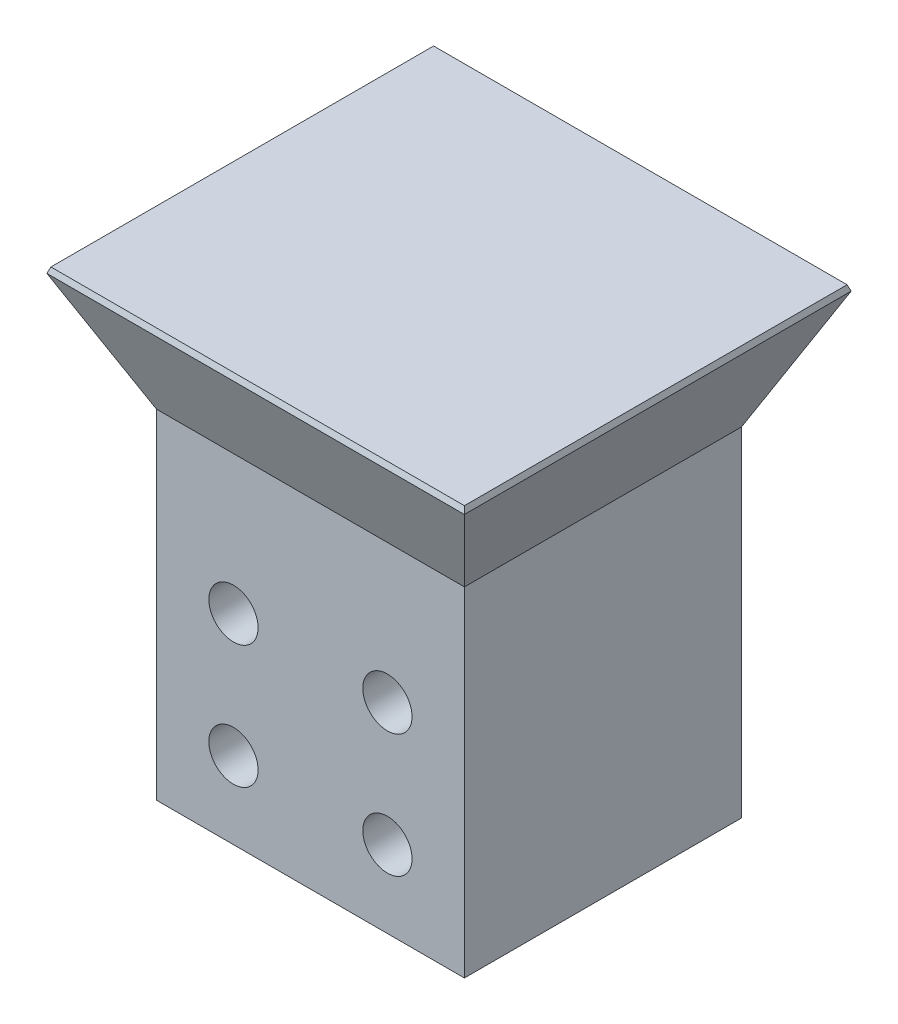
ISO-10303-21;
HEADER;
FILE_DESCRIPTION(('STEP AP214'),'2;1');
FILE_NAME('part.step','',(''),(''),'','','');
FILE_SCHEMA(('AUTOMOTIVE_DESIGN { 1 0 10303 214 1 1 1 1 }'));
ENDSEC;
DATA;
#1=APPLICATION_CONTEXT('core data for automotive mechanical design processes');
#2=APPLICATION_PROTOCOL_DEFINITION('international standard','automotive_design',2000,#1);
#3=PRODUCT_CONTEXT('',#1,'mechanical');
#4=PRODUCT('Part','Part','',(#3));
#5=PRODUCT_RELATED_PRODUCT_CATEGORY('part','',(#4));
#6=PRODUCT_DEFINITION_FORMATION('','',#4);
#7=PRODUCT_DEFINITION_CONTEXT('part definition',#1,'design');
#8=PRODUCT_DEFINITION('design','',#6,#7);
#9=PRODUCT_DEFINITION_SHAPE('','',#8);
#10=(LENGTH_UNIT() NAMED_UNIT(*) SI_UNIT(.MILLI.,.METRE.));
#11=(NAMED_UNIT(*) PLANE_ANGLE_UNIT() SI_UNIT($,.RADIAN.));
#12=(NAMED_UNIT(*) SI_UNIT($,.STERADIAN.) SOLID_ANGLE_UNIT());
#13=UNCERTAINTY_MEASURE_WITH_UNIT(LENGTH_MEASURE(1.E-05),#10,'distance_accuracy_value','');
#14=(GEOMETRIC_REPRESENTATION_CONTEXT(3) GLOBAL_UNCERTAINTY_ASSIGNED_CONTEXT((#13)) GLOBAL_UNIT_ASSIGNED_CONTEXT((#10,
#11,#12)) REPRESENTATION_CONTEXT('',''));
#15=CARTESIAN_POINT('',(0.,0.,0.));
#16=DIRECTION('',(0.,0.,1.));
#17=DIRECTION('',(1.,0.,0.));
#18=AXIS2_PLACEMENT_3D('',#15,#16,#17);
#19=CARTESIAN_POINT('',(10.,22.,9.));
#20=DIRECTION('',(-1.,0.,0.));
#21=DIRECTION('',(0.,0.,1.));
#22=AXIS2_PLACEMENT_3D('',#19,#20,#21);
#23=PLANE('',#22);
#24=DIRECTION('',(0.,0.,-1.));
#25=VECTOR('',#24,1.);
#26=CARTESIAN_POINT('',(10.,0.,9.));
#27=LINE('',#26,#25);
#28=CARTESIAN_POINT('',(10.,0.,9.));
#29=VERTEX_POINT('',#28);
#30=CARTESIAN_POINT('',(10.,0.,-9.));
#31=VERTEX_POINT('',#30);
#32=EDGE_CURVE('E115',#29,#31,#27,.T.);
#33=ORIENTED_EDGE('',*,*,#32,.T.);
#34=DIRECTION('',(0.,-1.,0.));
#35=VECTOR('',#34,1.);
#36=CARTESIAN_POINT('',(10.,22.,-9.));
#37=LINE('',#36,#35);
#38=CARTESIAN_POINT('',(10.,22.,-9.));
#39=VERTEX_POINT('',#38);
#40=EDGE_CURVE('E121',#39,#31,#37,.T.);
#41=ORIENTED_EDGE('',*,*,#40,.F.);
#42=DIRECTION('',(0.,0.,-1.));
#43=VECTOR('',#42,1.);
#44=CARTESIAN_POINT('',(10.,22.,9.));
#45=LINE('',#44,#43);
#46=CARTESIAN_POINT('',(10.,22.,9.));
#47=VERTEX_POINT('',#46);
#48=EDGE_CURVE('E107',#47,#39,#45,.T.);
#49=ORIENTED_EDGE('',*,*,#48,.F.);
#50=DIRECTION('',(0.,-1.,0.));
#51=VECTOR('',#50,1.);
#52=CARTESIAN_POINT('',(10.,22.,9.));
#53=LINE('',#52,#51);
#54=EDGE_CURVE('E118',#47,#29,#53,.T.);
#55=ORIENTED_EDGE('',*,*,#54,.T.);
#56=EDGE_LOOP('',(#33,#41,#49,#55));
#57=FACE_BOUND('',#56,.T.);
#58=ADVANCED_FACE('F37',(#57),#23,.F.);
#59=CARTESIAN_POINT('',(-10.,22.,-9.));
#60=DIRECTION('',(0.,0.,1.));
#61=DIRECTION('',(1.,0.,0.));
#62=AXIS2_PLACEMENT_3D('',#59,#60,#61);
#63=PLANE('',#62);
#64=CARTESIAN_POINT('',(5.,13.,-9.));
#65=DIRECTION('',(0.,0.,1.));
#66=DIRECTION('',(1.,0.,0.));
#67=AXIS2_PLACEMENT_3D('',#64,#65,#66);
#68=CIRCLE('',#67,1.6);
#69=CARTESIAN_POINT('',(6.6,13.,-9.));
#70=VERTEX_POINT('',#69);
#71=EDGE_CURVE('E206',#70,#70,#68,.T.);
#72=ORIENTED_EDGE('',*,*,#71,.T.);
#73=EDGE_LOOP('',(#72));
#74=FACE_BOUND('',#73,.T.);
#75=CARTESIAN_POINT('',(-5.,5.,-9.));
#76=DIRECTION('',(0.,0.,1.));
#77=DIRECTION('',(1.,0.,0.));
#78=AXIS2_PLACEMENT_3D('',#75,#76,#77);
#79=CIRCLE('',#78,1.6);
#80=CARTESIAN_POINT('',(-3.4,5.,-9.));
#81=VERTEX_POINT('',#80);
#82=EDGE_CURVE('E201',#81,#81,#79,.T.);
#83=ORIENTED_EDGE('',*,*,#82,.T.);
#84=EDGE_LOOP('',(#83));
#85=FACE_BOUND('',#84,.T.);
#86=CARTESIAN_POINT('',(5.,5.,-9.));
#87=DIRECTION('',(0.,0.,1.));
#88=DIRECTION('',(1.,0.,0.));
#89=AXIS2_PLACEMENT_3D('',#86,#87,#88);
#90=CIRCLE('',#89,1.6);
#91=CARTESIAN_POINT('',(6.6,5.,-9.));
#92=VERTEX_POINT('',#91);
#93=EDGE_CURVE('E199',#92,#92,#90,.T.);
#94=ORIENTED_EDGE('',*,*,#93,.T.);
#95=EDGE_LOOP('',(#94));
#96=FACE_BOUND('',#95,.T.);
#97=CARTESIAN_POINT('',(-5.,13.,-9.));
#98=DIRECTION('',(0.,0.,1.));
#99=DIRECTION('',(1.,0.,0.));
#100=AXIS2_PLACEMENT_3D('',#97,#98,#99);
#101=CIRCLE('',#100,1.6);
#102=CARTESIAN_POINT('',(-3.4,13.,-9.));
#103=VERTEX_POINT('',#102);
#104=EDGE_CURVE('E197',#103,#103,#101,.T.);
#105=ORIENTED_EDGE('',*,*,#104,.T.);
#106=EDGE_LOOP('',(#105));
#107=FACE_BOUND('',#106,.T.);
#108=DIRECTION('',(-1.,0.,0.));
#109=VECTOR('',#108,1.);
#110=CARTESIAN_POINT('',(-10.,0.,-9.));
#111=LINE('',#110,#109);
#112=CARTESIAN_POINT('',(-10.,0.,-9.));
#113=VERTEX_POINT('',#112);
#114=EDGE_CURVE('E148',#31,#113,#111,.T.);
#115=ORIENTED_EDGE('',*,*,#114,.T.);
#116=DIRECTION('',(0.,-1.,0.));
#117=VECTOR('',#116,1.);
#118=CARTESIAN_POINT('',(-10.,22.,-9.));
#119=LINE('',#118,#117);
#120=CARTESIAN_POINT('',(-10.,22.,-9.));
#121=VERTEX_POINT('',#120);
#122=EDGE_CURVE('E155',#121,#113,#119,.T.);
#123=ORIENTED_EDGE('',*,*,#122,.F.);
#124=DIRECTION('',(-1.,0.,0.));
#125=VECTOR('',#124,1.);
#126=CARTESIAN_POINT('',(-10.,22.,-9.));
#127=LINE('',#126,#125);
#128=EDGE_CURVE('E124',#39,#121,#127,.T.);
#129=ORIENTED_EDGE('',*,*,#128,.F.);
#130=ORIENTED_EDGE('',*,*,#40,.T.);
#131=EDGE_LOOP('',(#115,#123,#129,#130));
#132=FACE_BOUND('',#131,.T.);
#133=ADVANCED_FACE('F220',(#74,#85,#96,#107,#132),#63,.F.);
#134=CARTESIAN_POINT('',(-10.,22.,9.));
#135=DIRECTION('',(1.,0.,0.));
#136=DIRECTION('',(0.,0.,-1.));
#137=AXIS2_PLACEMENT_3D('',#134,#135,#136);
#138=PLANE('',#137);
#139=DIRECTION('',(0.,0.,1.));
#140=VECTOR('',#139,1.);
#141=CARTESIAN_POINT('',(-10.,0.,9.));
#142=LINE('',#141,#140);
#143=CARTESIAN_POINT('',(-10.,0.,9.));
#144=VERTEX_POINT('',#143);
#145=EDGE_CURVE('E146',#113,#144,#142,.T.);
#146=ORIENTED_EDGE('',*,*,#145,.T.);
#147=DIRECTION('',(0.,-1.,0.));
#148=VECTOR('',#147,1.);
#149=CARTESIAN_POINT('',(-10.,22.,9.));
#150=LINE('',#149,#148);
#151=CARTESIAN_POINT('',(-10.,22.,9.));
#152=VERTEX_POINT('',#151);
#153=EDGE_CURVE('E131',#152,#144,#150,.T.);
#154=ORIENTED_EDGE('',*,*,#153,.F.);
#155=DIRECTION('',(0.,0.,1.));
#156=VECTOR('',#155,1.);
#157=CARTESIAN_POINT('',(-10.,22.,9.));
#158=LINE('',#157,#156);
#159=EDGE_CURVE('E140',#121,#152,#158,.T.);
#160=ORIENTED_EDGE('',*,*,#159,.F.);
#161=ORIENTED_EDGE('',*,*,#122,.T.);
#162=EDGE_LOOP('',(#146,#154,#160,#161));
#163=FACE_BOUND('',#162,.T.);
#164=ADVANCED_FACE('F222',(#163),#138,.F.);
#165=CARTESIAN_POINT('',(-10.,22.,9.));
#166=DIRECTION('',(0.,0.,-1.));
#167=DIRECTION('',(-1.,0.,0.));
#168=AXIS2_PLACEMENT_3D('',#165,#166,#167);
#169=PLANE('',#168);
#170=CARTESIAN_POINT('',(5.,13.,9.));
#171=DIRECTION('',(0.,0.,1.));
#172=DIRECTION('',(1.,0.,0.));
#173=AXIS2_PLACEMENT_3D('',#170,#171,#172);
#174=CIRCLE('',#173,1.6);
#175=CARTESIAN_POINT('',(6.6,13.,9.));
#176=VERTEX_POINT('',#175);
#177=EDGE_CURVE('E186',#176,#176,#174,.T.);
#178=ORIENTED_EDGE('',*,*,#177,.F.);
#179=EDGE_LOOP('',(#178));
#180=FACE_BOUND('',#179,.T.);
#181=CARTESIAN_POINT('',(-5.,5.,9.));
#182=DIRECTION('',(0.,0.,1.));
#183=DIRECTION('',(1.,0.,0.));
#184=AXIS2_PLACEMENT_3D('',#181,#182,#183);
#185=CIRCLE('',#184,1.6);
#186=CARTESIAN_POINT('',(-3.4,5.,9.));
#187=VERTEX_POINT('',#186);
#188=EDGE_CURVE('E184',#187,#187,#185,.T.);
#189=ORIENTED_EDGE('',*,*,#188,.F.);
#190=EDGE_LOOP('',(#189));
#191=FACE_BOUND('',#190,.T.);
#192=CARTESIAN_POINT('',(5.,5.,9.));
#193=DIRECTION('',(0.,0.,1.));
#194=DIRECTION('',(1.,0.,0.));
#195=AXIS2_PLACEMENT_3D('',#192,#193,#194);
#196=CIRCLE('',#195,1.6);
#197=CARTESIAN_POINT('',(6.6,5.,9.));
#198=VERTEX_POINT('',#197);
#199=EDGE_CURVE('E179',#198,#198,#196,.T.);
#200=ORIENTED_EDGE('',*,*,#199,.F.);
#201=EDGE_LOOP('',(#200));
#202=FACE_BOUND('',#201,.T.);
#203=CARTESIAN_POINT('',(-5.,13.,9.));
#204=DIRECTION('',(0.,0.,1.));
#205=DIRECTION('',(1.,0.,0.));
#206=AXIS2_PLACEMENT_3D('',#203,#204,#205);
#207=CIRCLE('',#206,1.6);
#208=CARTESIAN_POINT('',(-3.4,13.,9.));
#209=VERTEX_POINT('',#208);
#210=EDGE_CURVE('E194',#209,#209,#207,.T.);
#211=ORIENTED_EDGE('',*,*,#210,.F.);
#212=EDGE_LOOP('',(#211));
#213=FACE_BOUND('',#212,.T.);
#214=DIRECTION('',(1.,0.,0.));
#215=VECTOR('',#214,1.);
#216=CARTESIAN_POINT('',(-10.,0.,9.));
#217=LINE('',#216,#215);
#218=EDGE_CURVE('E122',#144,#29,#217,.T.);
#219=ORIENTED_EDGE('',*,*,#218,.T.);
#220=ORIENTED_EDGE('',*,*,#54,.F.);
#221=DIRECTION('',(1.,0.,0.));
#222=VECTOR('',#221,1.);
#223=CARTESIAN_POINT('',(-10.,22.,9.));
#224=LINE('',#223,#222);
#225=EDGE_CURVE('E132',#152,#47,#224,.T.);
#226=ORIENTED_EDGE('',*,*,#225,.F.);
#227=ORIENTED_EDGE('',*,*,#153,.T.);
#228=EDGE_LOOP('',(#219,#220,#226,#227));
#229=FACE_BOUND('',#228,.T.);
#230=ADVANCED_FACE('F129',(#180,#191,#202,#213,#229),#169,.F.);
#231=CARTESIAN_POINT('',(0.,0.,0.));
#232=DIRECTION('',(0.,-1.,0.));
#233=DIRECTION('',(0.,0.,-1.));
#234=AXIS2_PLACEMENT_3D('',#231,#232,#233);
#235=PLANE('',#234);
#236=ORIENTED_EDGE('',*,*,#32,.F.);
#237=ORIENTED_EDGE('',*,*,#218,.F.);
#238=ORIENTED_EDGE('',*,*,#145,.F.);
#239=ORIENTED_EDGE('',*,*,#114,.F.);
#240=EDGE_LOOP('',(#236,#237,#238,#239));
#241=FACE_BOUND('',#240,.T.);
#242=ADVANCED_FACE('F338',(#241),#235,.T.);
#243=CARTESIAN_POINT('',(-10.,22.,9.));
#244=DIRECTION('',(0.,-0.4226182617407,0.90630778703665));
#245=DIRECTION('',(0.,-0.90630778703665,-0.4226182617407));
#246=AXIS2_PLACEMENT_3D('',#243,#244,#245);
#247=PLANE('',#246);
#248=DIRECTION('',(-0.389281620635026,-0.834817129478987,-0.389281620635026));
#249=VECTOR('',#248,1.);
#250=CARTESIAN_POINT('',(10.,22.,9.));
#251=LINE('',#250,#249);
#252=CARTESIAN_POINT('',(13.5614139605437,29.6374768851853,12.5614139605437));
#253=VERTEX_POINT('',#252);
#254=EDGE_CURVE('E104',#253,#47,#251,.T.);
#255=ORIENTED_EDGE('',*,*,#254,.F.);
#256=DIRECTION('',(1.,0.,0.));
#257=VECTOR('',#256,1.);
#258=CARTESIAN_POINT('',(-13.73046126524,29.6374768851853,12.5614139605437));
#259=LINE('',#258,#257);
#260=CARTESIAN_POINT('',(-13.5614139605437,29.6374768851853,12.5614139605437));
#261=VERTEX_POINT('',#260);
#262=EDGE_CURVE('E11',#253,#261,#259,.F.);
#263=ORIENTED_EDGE('',*,*,#262,.T.);
#264=DIRECTION('',(0.389281620635026,-0.834817129478987,-0.389281620635026));
#265=VECTOR('',#264,1.);
#266=CARTESIAN_POINT('',(-10.,22.,9.));
#267=LINE('',#266,#265);
#268=EDGE_CURVE('E139',#261,#152,#267,.T.);
#269=ORIENTED_EDGE('',*,*,#268,.T.);
#270=ORIENTED_EDGE('',*,*,#225,.T.);
#271=EDGE_LOOP('',(#255,#263,#269,#270));
#272=FACE_BOUND('',#271,.T.);
#273=ADVANCED_FACE('F136',(#272),#247,.T.);
#274=CARTESIAN_POINT('',(10.,22.,9.));
#275=DIRECTION('',(0.90630778703665,-0.4226182617407,0.));
#276=DIRECTION('',(0.4226182617407,0.90630778703665,0.));
#277=AXIS2_PLACEMENT_3D('',#274,#275,#276);
#278=PLANE('',#277);
#279=DIRECTION('',(-0.389281620635026,-0.834817129478987,0.389281620635026));
#280=VECTOR('',#279,1.);
#281=CARTESIAN_POINT('',(10.,22.,-9.));
#282=LINE('',#281,#280);
#283=CARTESIAN_POINT('',(13.5614139605437,29.6374768851853,-12.5614139605437));
#284=VERTEX_POINT('',#283);
#285=EDGE_CURVE('E114',#284,#39,#282,.T.);
#286=ORIENTED_EDGE('',*,*,#285,.F.);
#287=DIRECTION('',(0.,0.,-1.));
#288=VECTOR('',#287,1.);
#289=CARTESIAN_POINT('',(13.5614139605437,29.6374768851853,12.73046126524));
#290=LINE('',#289,#288);
#291=EDGE_CURVE('E49',#284,#253,#290,.F.);
#292=ORIENTED_EDGE('',*,*,#291,.T.);
#293=ORIENTED_EDGE('',*,*,#254,.T.);
#294=ORIENTED_EDGE('',*,*,#48,.T.);
#295=EDGE_LOOP('',(#286,#292,#293,#294));
#296=FACE_BOUND('',#295,.T.);
#297=ADVANCED_FACE('F110',(#296),#278,.T.);
#298=CARTESIAN_POINT('',(10.,22.,-9.));
#299=DIRECTION('',(0.,-0.4226182617407,-0.90630778703665));
#300=DIRECTION('',(0.,0.90630778703665,-0.4226182617407));
#301=AXIS2_PLACEMENT_3D('',#298,#299,#300);
#302=PLANE('',#301);
#303=DIRECTION('',(0.389281620635026,-0.834817129478987,0.389281620635026));
#304=VECTOR('',#303,1.);
#305=CARTESIAN_POINT('',(-10.,22.,-9.));
#306=LINE('',#305,#304);
#307=CARTESIAN_POINT('',(-13.5614139605437,29.6374768851853,-12.5614139605437));
#308=VERTEX_POINT('',#307);
#309=EDGE_CURVE('E209',#308,#121,#306,.T.);
#310=ORIENTED_EDGE('',*,*,#309,.F.);
#311=DIRECTION('',(-1.,0.,0.));
#312=VECTOR('',#311,1.);
#313=CARTESIAN_POINT('',(13.73046126524,29.6374768851853,-12.5614139605437));
#314=LINE('',#313,#312);
#315=EDGE_CURVE('E63',#308,#284,#314,.F.);
#316=ORIENTED_EDGE('',*,*,#315,.T.);
#317=ORIENTED_EDGE('',*,*,#285,.T.);
#318=ORIENTED_EDGE('',*,*,#128,.T.);
#319=EDGE_LOOP('',(#310,#316,#317,#318));
#320=FACE_BOUND('',#319,.T.);
#321=ADVANCED_FACE('F212',(#320),#302,.T.);
#322=CARTESIAN_POINT('',(-10.,22.,-9.));
#323=DIRECTION('',(-0.90630778703665,-0.4226182617407,0.));
#324=DIRECTION('',(0.4226182617407,-0.90630778703665,0.));
#325=AXIS2_PLACEMENT_3D('',#322,#323,#324);
#326=PLANE('',#325);
#327=ORIENTED_EDGE('',*,*,#268,.F.);
#328=DIRECTION('',(0.,0.,1.));
#329=VECTOR('',#328,1.);
#330=CARTESIAN_POINT('',(-13.5614139605437,29.6374768851853,-12.73046126524));
#331=LINE('',#330,#329);
#332=EDGE_CURVE('E164',#261,#308,#331,.F.);
#333=ORIENTED_EDGE('',*,*,#332,.T.);
#334=ORIENTED_EDGE('',*,*,#309,.T.);
#335=ORIENTED_EDGE('',*,*,#159,.T.);
#336=EDGE_LOOP('',(#327,#333,#334,#335));
#337=FACE_BOUND('',#336,.T.);
#338=ADVANCED_FACE('F224',(#337),#326,.T.);
#339=CARTESIAN_POINT('',(0.,30.,0.));
#340=DIRECTION('',(0.,1.,0.));
#341=DIRECTION('',(0.,0.,1.));
#342=AXIS2_PLACEMENT_3D('',#339,#340,#341);
#343=PLANE('',#342);
#344=DIRECTION('',(-1.,0.,0.));
#345=VECTOR('',#344,1.);
#346=CARTESIAN_POINT('',(-13.73046126524,30.,-12.4294663375177));
#347=LINE('',#346,#345);
#348=CARTESIAN_POINT('',(13.4294663375177,30.,-12.4294663375177));
#349=VERTEX_POINT('',#348);
#350=CARTESIAN_POINT('',(-13.4294663375177,30.,-12.4294663375177));
#351=VERTEX_POINT('',#350);
#352=EDGE_CURVE('E159',#349,#351,#347,.T.);
#353=ORIENTED_EDGE('',*,*,#352,.T.);
#354=DIRECTION('',(0.,0.,1.));
#355=VECTOR('',#354,1.);
#356=CARTESIAN_POINT('',(-13.4294663375177,30.,12.73046126524));
#357=LINE('',#356,#355);
#358=CARTESIAN_POINT('',(-13.4294663375177,30.,12.4294663375177));
#359=VERTEX_POINT('',#358);
#360=EDGE_CURVE('E165',#351,#359,#357,.T.);
#361=ORIENTED_EDGE('',*,*,#360,.T.);
#362=DIRECTION('',(1.,0.,0.));
#363=VECTOR('',#362,1.);
#364=CARTESIAN_POINT('',(13.73046126524,30.,12.4294663375177));
#365=LINE('',#364,#363);
#366=CARTESIAN_POINT('',(13.4294663375177,30.,12.4294663375177));
#367=VERTEX_POINT('',#366);
#368=EDGE_CURVE('E156',#359,#367,#365,.T.);
#369=ORIENTED_EDGE('',*,*,#368,.T.);
#370=DIRECTION('',(0.,0.,-1.));
#371=VECTOR('',#370,1.);
#372=CARTESIAN_POINT('',(13.4294663375177,30.,-12.73046126524));
#373=LINE('',#372,#371);
#374=EDGE_CURVE('E158',#367,#349,#373,.T.);
#375=ORIENTED_EDGE('',*,*,#374,.T.);
#376=EDGE_LOOP('',(#353,#361,#369,#375));
#377=FACE_BOUND('',#376,.T.);
#378=ADVANCED_FACE('F231',(#377),#343,.T.);
#379=CARTESIAN_POINT('',(-5.,13.,-12.73046126524));
#380=DIRECTION('',(0.,0.,1.));
#381=DIRECTION('',(1.,0.,0.));
#382=AXIS2_PLACEMENT_3D('',#379,#380,#381);
#383=CYLINDRICAL_SURFACE('',#382,1.6);
#384=ORIENTED_EDGE('',*,*,#210,.T.);
#385=EDGE_LOOP('',(#384));
#386=FACE_BOUND('',#385,.T.);
#387=ORIENTED_EDGE('',*,*,#104,.F.);
#388=EDGE_LOOP('',(#387));
#389=FACE_BOUND('',#388,.T.);
#390=ADVANCED_FACE('F304',(#386,#389),#383,.F.);
#391=CARTESIAN_POINT('',(5.,5.,-12.73046126524));
#392=DIRECTION('',(0.,0.,1.));
#393=DIRECTION('',(1.,0.,0.));
#394=AXIS2_PLACEMENT_3D('',#391,#392,#393);
#395=CYLINDRICAL_SURFACE('',#394,1.6);
#396=ORIENTED_EDGE('',*,*,#199,.T.);
#397=EDGE_LOOP('',(#396));
#398=FACE_BOUND('',#397,.T.);
#399=ORIENTED_EDGE('',*,*,#93,.F.);
#400=EDGE_LOOP('',(#399));
#401=FACE_BOUND('',#400,.T.);
#402=ADVANCED_FACE('F293',(#398,#401),#395,.F.);
#403=CARTESIAN_POINT('',(-5.,5.,-12.73046126524));
#404=DIRECTION('',(0.,0.,1.));
#405=DIRECTION('',(1.,0.,0.));
#406=AXIS2_PLACEMENT_3D('',#403,#404,#405);
#407=CYLINDRICAL_SURFACE('',#406,1.6);
#408=ORIENTED_EDGE('',*,*,#188,.T.);
#409=EDGE_LOOP('',(#408));
#410=FACE_BOUND('',#409,.T.);
#411=ORIENTED_EDGE('',*,*,#82,.F.);
#412=EDGE_LOOP('',(#411));
#413=FACE_BOUND('',#412,.T.);
#414=ADVANCED_FACE('F288',(#410,#413),#407,.F.);
#415=CARTESIAN_POINT('',(5.,13.,-12.73046126524));
#416=DIRECTION('',(0.,0.,1.));
#417=DIRECTION('',(1.,0.,0.));
#418=AXIS2_PLACEMENT_3D('',#415,#416,#417);
#419=CYLINDRICAL_SURFACE('',#418,1.6);
#420=ORIENTED_EDGE('',*,*,#177,.T.);
#421=EDGE_LOOP('',(#420));
#422=FACE_BOUND('',#421,.T.);
#423=ORIENTED_EDGE('',*,*,#71,.F.);
#424=EDGE_LOOP('',(#423));
#425=FACE_BOUND('',#424,.T.);
#426=ADVANCED_FACE('F242',(#422,#425),#419,.F.);
#427=CARTESIAN_POINT('',(13.4294663375177,30.,0.));
#428=DIRECTION('',(-0.939692620785911,-0.342020143325662,0.));
#429=DIRECTION('',(0.,0.,-1.));
#430=AXIS2_PLACEMENT_3D('',#427,#428,#429);
#431=PLANE('',#430);
#432=DIRECTION('',(-0.323615577118178,0.889126490715991,-0.323615577118183));
#433=VECTOR('',#432,1.);
#434=CARTESIAN_POINT('',(12.0230380556608,33.8641299464842,11.0230380556608));
#435=LINE('',#434,#433);
#436=EDGE_CURVE('E174',#253,#367,#435,.T.);
#437=ORIENTED_EDGE('',*,*,#436,.F.);
#438=ORIENTED_EDGE('',*,*,#291,.F.);
#439=DIRECTION('',(-0.323615577118178,0.889126490715991,0.323615577118183));
#440=VECTOR('',#439,1.);
#441=CARTESIAN_POINT('',(12.1277650974144,33.5763947640601,-11.1277650974143));
#442=LINE('',#441,#440);
#443=EDGE_CURVE('E44',#349,#284,#442,.F.);
#444=ORIENTED_EDGE('',*,*,#443,.F.);
#445=ORIENTED_EDGE('',*,*,#374,.F.);
#446=EDGE_LOOP('',(#437,#438,#444,#445));
#447=FACE_BOUND('',#446,.T.);
#448=ADVANCED_FACE('F43',(#447),#431,.F.);
#449=CARTESIAN_POINT('',(0.,30.,-12.4294663375177));
#450=DIRECTION('',(0.,-0.342020143325666,0.939692620785909));
#451=DIRECTION('',(-1.,0.,0.));
#452=AXIS2_PLACEMENT_3D('',#449,#450,#451);
#453=PLANE('',#452);
#454=ORIENTED_EDGE('',*,*,#443,.T.);
#455=ORIENTED_EDGE('',*,*,#315,.F.);
#456=DIRECTION('',(0.323615577118178,0.889126490715991,0.323615577118183));
#457=VECTOR('',#456,1.);
#458=CARTESIAN_POINT('',(-12.0230380556608,33.8641299464842,-11.0230380556608));
#459=LINE('',#458,#457);
#460=EDGE_CURVE('E175',#351,#308,#459,.F.);
#461=ORIENTED_EDGE('',*,*,#460,.F.);
#462=ORIENTED_EDGE('',*,*,#352,.F.);
#463=EDGE_LOOP('',(#454,#455,#461,#462));
#464=FACE_BOUND('',#463,.T.);
#465=ADVANCED_FACE('F234',(#464),#453,.F.);
#466=CARTESIAN_POINT('',(0.,30.,12.4294663375177));
#467=DIRECTION('',(0.,-0.342020143325666,-0.939692620785909));
#468=DIRECTION('',(1.,0.,0.));
#469=AXIS2_PLACEMENT_3D('',#466,#467,#468);
#470=PLANE('',#469);
#471=ORIENTED_EDGE('',*,*,#436,.T.);
#472=ORIENTED_EDGE('',*,*,#368,.F.);
#473=DIRECTION('',(-0.323615577118178,-0.889126490715991,0.323615577118183));
#474=VECTOR('',#473,1.);
#475=CARTESIAN_POINT('',(-12.0230380556608,33.8641299464842,11.0230380556608));
#476=LINE('',#475,#474);
#477=EDGE_CURVE('E168',#261,#359,#476,.F.);
#478=ORIENTED_EDGE('',*,*,#477,.F.);
#479=ORIENTED_EDGE('',*,*,#262,.F.);
#480=EDGE_LOOP('',(#471,#472,#478,#479));
#481=FACE_BOUND('',#480,.T.);
#482=ADVANCED_FACE('F228',(#481),#470,.F.);
#483=CARTESIAN_POINT('',(-13.4294663375177,30.,0.));
#484=DIRECTION('',(0.939692620785911,-0.342020143325662,0.));
#485=DIRECTION('',(0.,0.,1.));
#486=AXIS2_PLACEMENT_3D('',#483,#484,#485);
#487=PLANE('',#486);
#488=ORIENTED_EDGE('',*,*,#460,.T.);
#489=ORIENTED_EDGE('',*,*,#332,.F.);
#490=ORIENTED_EDGE('',*,*,#477,.T.);
#491=ORIENTED_EDGE('',*,*,#360,.F.);
#492=EDGE_LOOP('',(#488,#489,#490,#491));
#493=FACE_BOUND('',#492,.T.);
#494=ADVANCED_FACE('F230',(#493),#487,.F.);
#495=CLOSED_SHELL('',(#58,#133,#164,#230,#242,#273,#297,#321,#338,#378,#390,#402,#414,#426,#448,
#465,#482,#494));
#496=MANIFOLD_SOLID_BREP('B2',#495);
#497=ADVANCED_BREP_SHAPE_REPRESENTATION('',(#18,#496),#14);
#498=SHAPE_DEFINITION_REPRESENTATION(#9,#497);
ENDSEC;
END-ISO-10303-21;
